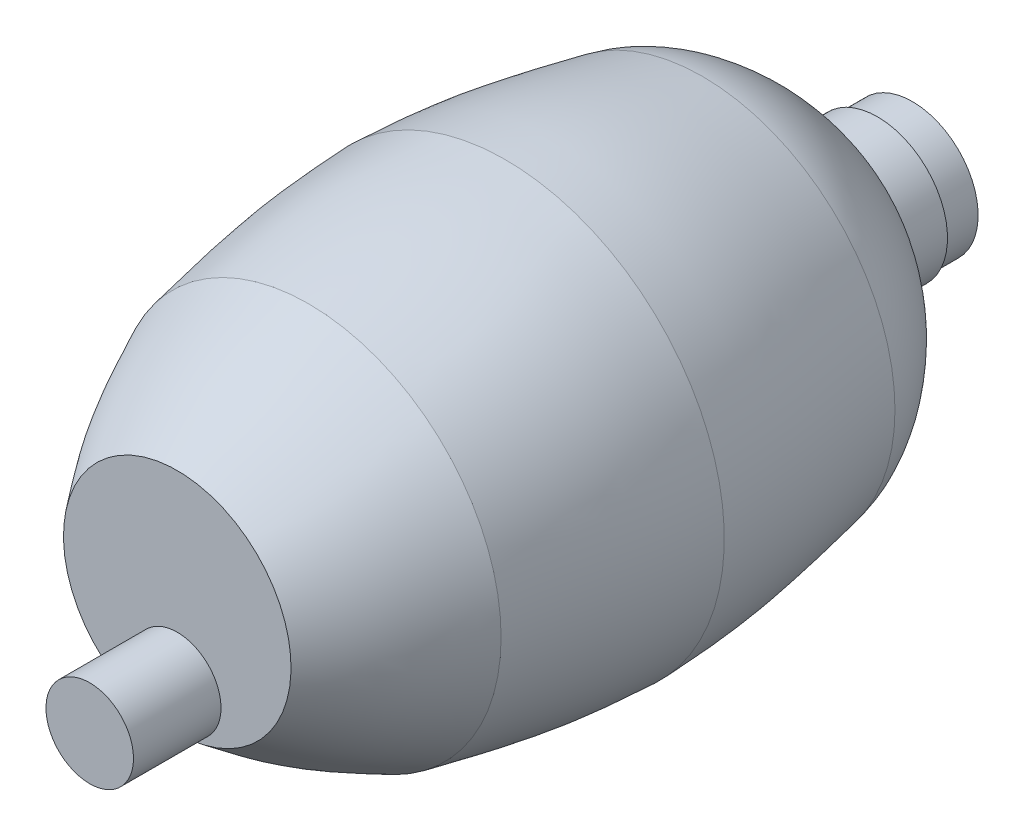
ISO-10303-21;
HEADER;
FILE_DESCRIPTION(('STEP AP214'),'2;1');
FILE_NAME('part.step','',(''),(''),'','','');
FILE_SCHEMA(('AUTOMOTIVE_DESIGN { 1 0 10303 214 1 1 1 1 }'));
ENDSEC;
DATA;
#1=APPLICATION_CONTEXT('core data for automotive mechanical design processes');
#2=APPLICATION_PROTOCOL_DEFINITION('international standard','automotive_design',2000,#1);
#3=PRODUCT_CONTEXT('',#1,'mechanical');
#4=PRODUCT('Part','Part','',(#3));
#5=PRODUCT_RELATED_PRODUCT_CATEGORY('part','',(#4));
#6=PRODUCT_DEFINITION_FORMATION('','',#4);
#7=PRODUCT_DEFINITION_CONTEXT('part definition',#1,'design');
#8=PRODUCT_DEFINITION('design','',#6,#7);
#9=PRODUCT_DEFINITION_SHAPE('','',#8);
#10=(LENGTH_UNIT() NAMED_UNIT(*) SI_UNIT(.MILLI.,.METRE.));
#11=(NAMED_UNIT(*) PLANE_ANGLE_UNIT() SI_UNIT($,.RADIAN.));
#12=(NAMED_UNIT(*) SI_UNIT($,.STERADIAN.) SOLID_ANGLE_UNIT());
#13=UNCERTAINTY_MEASURE_WITH_UNIT(LENGTH_MEASURE(1.E-05),#10,'distance_accuracy_value','');
#14=(GEOMETRIC_REPRESENTATION_CONTEXT(3) GLOBAL_UNCERTAINTY_ASSIGNED_CONTEXT((#13)) GLOBAL_UNIT_ASSIGNED_CONTEXT((#10,
#11,#12)) REPRESENTATION_CONTEXT('',''));
#15=CARTESIAN_POINT('',(0.,0.,0.));
#16=DIRECTION('',(0.,0.,1.));
#17=DIRECTION('',(1.,0.,0.));
#18=AXIS2_PLACEMENT_3D('',#15,#16,#17);
#19=CARTESIAN_POINT('',(0.,0.,95.25));
#20=DIRECTION('',(0.,0.,-1.));
#21=DIRECTION('',(-1.,0.,0.));
#22=AXIS2_PLACEMENT_3D('',#19,#20,#21);
#23=PLANE('',#22);
#24=CARTESIAN_POINT('',(0.,0.,95.25));
#25=DIRECTION('',(0.,0.,-1.));
#26=DIRECTION('',(-1.,0.,0.));
#27=AXIS2_PLACEMENT_3D('',#24,#25,#26);
#28=CIRCLE('',#27,33.02);
#29=CARTESIAN_POINT('',(0.,-33.02,95.25));
#30=VERTEX_POINT('',#29);
#31=EDGE_CURVE('E13',#30,#30,#28,.T.);
#32=ORIENTED_EDGE('',*,*,#31,.F.);
#33=CARTESIAN_POINT('',(0.,-20.32,95.25));
#34=DIRECTION('',(0.,0.,1.));
#35=DIRECTION('',(1.,0.,0.));
#36=AXIS2_PLACEMENT_3D('',#33,#34,#35);
#37=CIRCLE('',#36,12.7);
#38=EDGE_CURVE('E56',#30,#30,#37,.T.);
#39=ORIENTED_EDGE('',*,*,#38,.F.);
#40=EDGE_LOOP('',(#32,#39));
#41=FACE_BOUND('',#40,.T.);
#42=ADVANCED_FACE('F44',(#41),#23,.F.);
#43=CARTESIAN_POINT('',(19.05,0.,-118.11));
#44=DIRECTION('',(0.,0.,1.));
#45=DIRECTION('',(1.,0.,0.));
#46=AXIS2_PLACEMENT_3D('',#43,#44,#45);
#47=PLANE('',#46);
#48=CARTESIAN_POINT('',(0.,0.,-118.11));
#49=DIRECTION('',(0.,0.,-1.));
#50=DIRECTION('',(-1.,0.,0.));
#51=AXIS2_PLACEMENT_3D('',#48,#49,#50);
#52=CIRCLE('',#51,19.05);
#53=CARTESIAN_POINT('',(-19.0500000000001,0.,-118.11));
#54=VERTEX_POINT('',#53);
#55=EDGE_CURVE('E173',#54,#54,#52,.T.);
#56=ORIENTED_EDGE('',*,*,#55,.T.);
#57=EDGE_LOOP('',(#56));
#58=FACE_BOUND('',#57,.T.);
#59=ADVANCED_FACE('F46',(#58),#47,.F.);
#60=CARTESIAN_POINT('',(33.02,0.,95.25));
#61=CARTESIAN_POINT('',(36.9943346591665,0.,89.9893504800427));
#62=CARTESIAN_POINT('',(45.9655622436134,0.,78.1145366727306));
#63=CARTESIAN_POINT('',(52.3332534030959,0.,64.6497595352071));
#64=CARTESIAN_POINT('',(55.88,0.,57.15));
#65=B_SPLINE_CURVE_WITH_KNOTS('',3,(#60,#61,#62,#63,#64),.UNSPECIFIED.,.F.,.F.,(4,1,4),(0.,
0.443009010947021,1.),.UNSPECIFIED.);
#66=CARTESIAN_POINT('',(0.,0.,-95.25));
#67=DIRECTION('',(0.,0.,-1.));
#68=AXIS1_PLACEMENT('',#66,#67);
#69=SURFACE_OF_REVOLUTION('',#65,#68);
#70=CARTESIAN_POINT('',(0.,0.,57.15));
#71=DIRECTION('',(0.,0.,-1.));
#72=DIRECTION('',(-1.,0.,0.));
#73=AXIS2_PLACEMENT_3D('',#70,#71,#72);
#74=CIRCLE('',#73,55.88);
#75=CARTESIAN_POINT('',(-55.88,0.,57.15));
#76=VERTEX_POINT('',#75);
#77=EDGE_CURVE('E51',#76,#76,#74,.T.);
#78=ORIENTED_EDGE('',*,*,#77,.F.);
#79=EDGE_LOOP('',(#78));
#80=FACE_BOUND('',#79,.T.);
#81=ORIENTED_EDGE('',*,*,#31,.T.);
#82=EDGE_LOOP('',(#81));
#83=FACE_BOUND('',#82,.T.);
#84=ADVANCED_FACE('F58',(#80,#83),#69,.T.);
#85=CARTESIAN_POINT('',(55.88,0.,57.15));
#86=CARTESIAN_POINT('',(58.4183454972116,0.,44.4990748199973));
#87=CARTESIAN_POINT('',(62.2113742071975,0.,25.5949018189828));
#88=CARTESIAN_POINT('',(63.1796930620214,0.,6.36199017223718));
#89=CARTESIAN_POINT('',(63.5,0.,0.));
#90=B_SPLINE_CURVE_WITH_KNOTS('',3,(#85,#86,#87,#88,#89),.UNSPECIFIED.,.F.,.F.,(4,1,4),(0.,
0.669213362537664,1.),.UNSPECIFIED.);
#91=CARTESIAN_POINT('',(0.,0.,-95.25));
#92=DIRECTION('',(0.,0.,-1.));
#93=AXIS1_PLACEMENT('',#91,#92);
#94=SURFACE_OF_REVOLUTION('',#90,#93);
#95=CARTESIAN_POINT('',(0.,0.,0.));
#96=DIRECTION('',(0.,0.,-1.));
#97=DIRECTION('',(-1.,0.,0.));
#98=AXIS2_PLACEMENT_3D('',#95,#96,#97);
#99=CIRCLE('',#98,63.5);
#100=CARTESIAN_POINT('',(-63.5,0.,0.));
#101=VERTEX_POINT('',#100);
#102=EDGE_CURVE('E192',#101,#101,#99,.T.);
#103=ORIENTED_EDGE('',*,*,#102,.F.);
#104=EDGE_LOOP('',(#103));
#105=FACE_BOUND('',#104,.T.);
#106=ORIENTED_EDGE('',*,*,#77,.T.);
#107=EDGE_LOOP('',(#106));
#108=FACE_BOUND('',#107,.T.);
#109=ADVANCED_FACE('F60',(#105,#108),#94,.T.);
#110=CARTESIAN_POINT('',(63.5,0.,0.));
#111=CARTESIAN_POINT('',(63.1796930620214,0.,-6.36199017223718));
#112=CARTESIAN_POINT('',(62.2113742071975,0.,-25.5949018189828));
#113=CARTESIAN_POINT('',(58.4183454972116,0.,-44.4990748199973));
#114=CARTESIAN_POINT('',(55.88,0.,-57.15));
#115=B_SPLINE_CURVE_WITH_KNOTS('',3,(#110,#111,#112,#113,#114),.UNSPECIFIED.,.F.,.F.,(4,1,4),
(0.,0.330786637462336,1.),.UNSPECIFIED.);
#116=CARTESIAN_POINT('',(0.,0.,-95.25));
#117=DIRECTION('',(0.,0.,-1.));
#118=AXIS1_PLACEMENT('',#116,#117);
#119=SURFACE_OF_REVOLUTION('',#115,#118);
#120=CARTESIAN_POINT('',(0.,0.,-57.15));
#121=DIRECTION('',(0.,0.,-1.));
#122=DIRECTION('',(-1.,0.,0.));
#123=AXIS2_PLACEMENT_3D('',#120,#121,#122);
#124=CIRCLE('',#123,55.88);
#125=CARTESIAN_POINT('',(-55.8800000000001,0.,-57.15));
#126=VERTEX_POINT('',#125);
#127=EDGE_CURVE('E189',#126,#126,#124,.T.);
#128=ORIENTED_EDGE('',*,*,#127,.F.);
#129=EDGE_LOOP('',(#128));
#130=FACE_BOUND('',#129,.T.);
#131=ORIENTED_EDGE('',*,*,#102,.T.);
#132=EDGE_LOOP('',(#131));
#133=FACE_BOUND('',#132,.T.);
#134=ADVANCED_FACE('F67',(#130,#133),#119,.T.);
#135=CARTESIAN_POINT('',(55.88,0.,-57.15));
#136=CARTESIAN_POINT('',(54.0755149658879,0.,-66.1434192095065));
#137=CARTESIAN_POINT('',(42.5639065979441,0.,-82.4104148309382));
#138=CARTESIAN_POINT('',(27.2639831039677,0.,-91.241807370556));
#139=CARTESIAN_POINT('',(20.32,0.,-95.25));
#140=B_SPLINE_CURVE_WITH_KNOTS('',3,(#135,#136,#137,#138,#139),.UNSPECIFIED.,.F.,.F.,(4,1,4),
(0.,0.546142625699955,1.),.UNSPECIFIED.);
#141=CARTESIAN_POINT('',(0.,0.,-95.25));
#142=DIRECTION('',(0.,0.,-1.));
#143=AXIS1_PLACEMENT('',#141,#142);
#144=SURFACE_OF_REVOLUTION('',#140,#143);
#145=CARTESIAN_POINT('',(0.,0.,-95.25));
#146=DIRECTION('',(0.,0.,-1.));
#147=DIRECTION('',(-1.,0.,0.));
#148=AXIS2_PLACEMENT_3D('',#145,#146,#147);
#149=CIRCLE('',#148,20.32);
#150=CARTESIAN_POINT('',(-20.32,0.,-95.25));
#151=VERTEX_POINT('',#150);
#152=EDGE_CURVE('E186',#151,#151,#149,.T.);
#153=ORIENTED_EDGE('',*,*,#152,.F.);
#154=EDGE_LOOP('',(#153));
#155=FACE_BOUND('',#154,.T.);
#156=ORIENTED_EDGE('',*,*,#127,.T.);
#157=EDGE_LOOP('',(#156));
#158=FACE_BOUND('',#157,.T.);
#159=ADVANCED_FACE('F97',(#155,#158),#144,.T.);
#160=CARTESIAN_POINT('',(0.,0.,-95.25));
#161=DIRECTION('',(0.,0.,-1.));
#162=DIRECTION('',(-1.,0.,0.));
#163=AXIS2_PLACEMENT_3D('',#160,#161,#162);
#164=CYLINDRICAL_SURFACE('',#163,20.32);
#165=CARTESIAN_POINT('',(0.,0.,-107.95));
#166=DIRECTION('',(0.,0.,-1.));
#167=DIRECTION('',(-1.,0.,0.));
#168=AXIS2_PLACEMENT_3D('',#165,#166,#167);
#169=CIRCLE('',#168,20.32);
#170=CARTESIAN_POINT('',(-20.32,0.,-107.95));
#171=VERTEX_POINT('',#170);
#172=EDGE_CURVE('E183',#171,#171,#169,.T.);
#173=ORIENTED_EDGE('',*,*,#172,.F.);
#174=EDGE_LOOP('',(#173));
#175=FACE_BOUND('',#174,.T.);
#176=ORIENTED_EDGE('',*,*,#152,.T.);
#177=EDGE_LOOP('',(#176));
#178=FACE_BOUND('',#177,.T.);
#179=ADVANCED_FACE('F107',(#175,#178),#164,.T.);
#180=CARTESIAN_POINT('',(20.32,0.,-107.95));
#181=DIRECTION('',(0.,0.,1.));
#182=DIRECTION('',(1.,0.,0.));
#183=AXIS2_PLACEMENT_3D('',#180,#181,#182);
#184=PLANE('',#183);
#185=CARTESIAN_POINT('',(0.,0.,-107.95));
#186=DIRECTION('',(0.,0.,-1.));
#187=DIRECTION('',(-1.,0.,0.));
#188=AXIS2_PLACEMENT_3D('',#185,#186,#187);
#189=CIRCLE('',#188,19.05);
#190=CARTESIAN_POINT('',(-19.0500000000001,0.,-107.95));
#191=VERTEX_POINT('',#190);
#192=EDGE_CURVE('E179',#191,#191,#189,.T.);
#193=ORIENTED_EDGE('',*,*,#192,.F.);
#194=EDGE_LOOP('',(#193));
#195=FACE_BOUND('',#194,.T.);
#196=ORIENTED_EDGE('',*,*,#172,.T.);
#197=EDGE_LOOP('',(#196));
#198=FACE_BOUND('',#197,.T.);
#199=ADVANCED_FACE('F117',(#195,#198),#184,.F.);
#200=CARTESIAN_POINT('',(0.,0.,-95.25));
#201=DIRECTION('',(0.,0.,-1.));
#202=DIRECTION('',(-1.,0.,0.));
#203=AXIS2_PLACEMENT_3D('',#200,#201,#202);
#204=CYLINDRICAL_SURFACE('',#203,19.05);
#205=ORIENTED_EDGE('',*,*,#55,.F.);
#206=EDGE_LOOP('',(#205));
#207=FACE_BOUND('',#206,.T.);
#208=ORIENTED_EDGE('',*,*,#192,.T.);
#209=EDGE_LOOP('',(#208));
#210=FACE_BOUND('',#209,.T.);
#211=ADVANCED_FACE('F126',(#207,#210),#204,.T.);
#212=CARTESIAN_POINT('',(0.,-20.32,120.65));
#213=DIRECTION('',(0.,0.,-1.));
#214=DIRECTION('',(-1.,0.,0.));
#215=AXIS2_PLACEMENT_3D('',#212,#213,#214);
#216=CYLINDRICAL_SURFACE('',#215,12.7);
#217=CARTESIAN_POINT('',(0.,-20.32,120.65));
#218=DIRECTION('',(0.,0.,1.));
#219=DIRECTION('',(1.,0.,0.));
#220=AXIS2_PLACEMENT_3D('',#217,#218,#219);
#221=CIRCLE('',#220,12.7);
#222=CARTESIAN_POINT('',(12.7,-20.32,120.65));
#223=VERTEX_POINT('',#222);
#224=EDGE_CURVE('E180',#223,#223,#221,.T.);
#225=ORIENTED_EDGE('',*,*,#224,.F.);
#226=EDGE_LOOP('',(#225));
#227=FACE_BOUND('',#226,.T.);
#228=ORIENTED_EDGE('',*,*,#38,.T.);
#229=EDGE_LOOP('',(#228));
#230=FACE_BOUND('',#229,.T.);
#231=ADVANCED_FACE('F135',(#227,#230),#216,.T.);
#232=CARTESIAN_POINT('',(0.,-20.32,120.65));
#233=DIRECTION('',(0.,0.,1.));
#234=DIRECTION('',(1.,0.,0.));
#235=AXIS2_PLACEMENT_3D('',#232,#233,#234);
#236=PLANE('',#235);
#237=ORIENTED_EDGE('',*,*,#224,.T.);
#238=EDGE_LOOP('',(#237));
#239=FACE_BOUND('',#238,.T.);
#240=ADVANCED_FACE('F145',(#239),#236,.T.);
#241=CLOSED_SHELL('',(#42,#59,#84,#109,#134,#159,#179,#199,#211,#231,#240));
#242=MANIFOLD_SOLID_BREP('B2',#241);
#243=ADVANCED_BREP_SHAPE_REPRESENTATION('',(#18,#242),#14);
#244=SHAPE_DEFINITION_REPRESENTATION(#9,#243);
ENDSEC;
END-ISO-10303-21;
